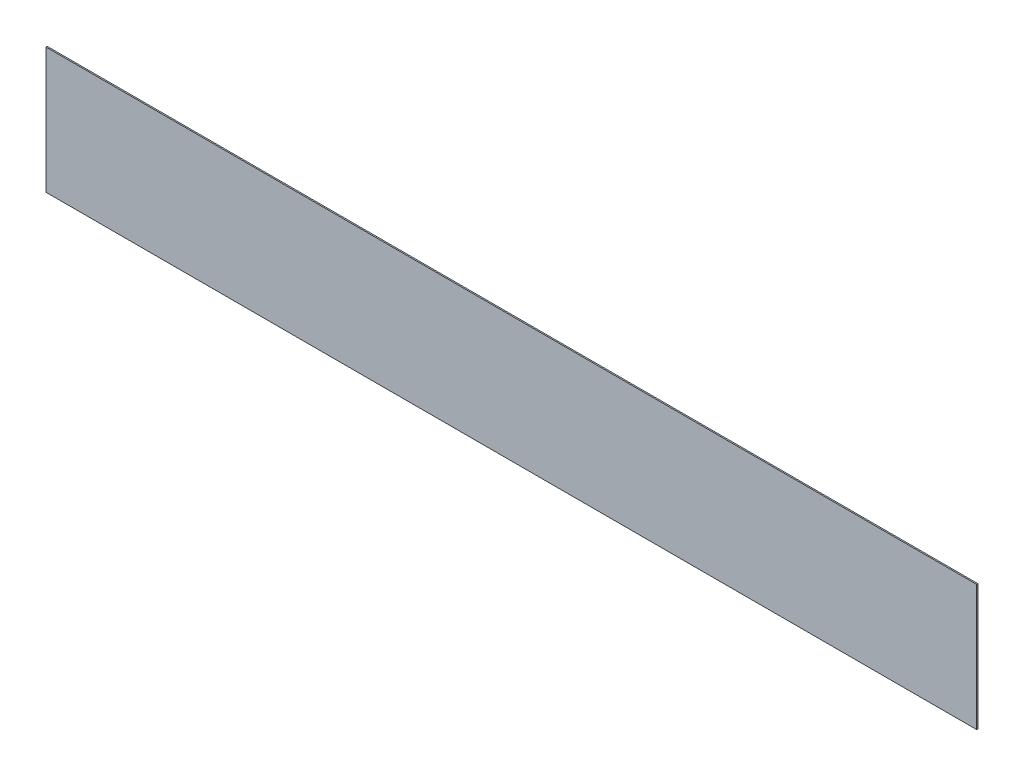
ISO-10303-21;
HEADER;
FILE_DESCRIPTION(('STEP AP214'),'2;1');
FILE_NAME('part.step','',(''),(''),'','','');
FILE_SCHEMA(('AUTOMOTIVE_DESIGN { 1 0 10303 214 1 1 1 1 }'));
ENDSEC;
DATA;
#1=APPLICATION_CONTEXT('core data for automotive mechanical design processes');
#2=APPLICATION_PROTOCOL_DEFINITION('international standard','automotive_design',2000,#1);
#3=PRODUCT_CONTEXT('',#1,'mechanical');
#4=PRODUCT('Part','Part','',(#3));
#5=PRODUCT_RELATED_PRODUCT_CATEGORY('part','',(#4));
#6=PRODUCT_DEFINITION_FORMATION('','',#4);
#7=PRODUCT_DEFINITION_CONTEXT('part definition',#1,'design');
#8=PRODUCT_DEFINITION('design','',#6,#7);
#9=PRODUCT_DEFINITION_SHAPE('','',#8);
#10=(LENGTH_UNIT() NAMED_UNIT(*) SI_UNIT(.MILLI.,.METRE.));
#11=(NAMED_UNIT(*) PLANE_ANGLE_UNIT() SI_UNIT($,.RADIAN.));
#12=(NAMED_UNIT(*) SI_UNIT($,.STERADIAN.) SOLID_ANGLE_UNIT());
#13=UNCERTAINTY_MEASURE_WITH_UNIT(LENGTH_MEASURE(1.E-05),#10,'distance_accuracy_value','');
#14=(GEOMETRIC_REPRESENTATION_CONTEXT(3) GLOBAL_UNCERTAINTY_ASSIGNED_CONTEXT((#13)) GLOBAL_UNIT_ASSIGNED_CONTEXT((#10,
#11,#12)) REPRESENTATION_CONTEXT('',''));
#15=CARTESIAN_POINT('',(0.,0.,0.));
#16=DIRECTION('',(0.,0.,1.));
#17=DIRECTION('',(1.,0.,0.));
#18=AXIS2_PLACEMENT_3D('',#15,#16,#17);
#19=CARTESIAN_POINT('',(-37.,-5.,0.1));
#20=DIRECTION('',(1.,0.,0.));
#21=DIRECTION('',(0.,1.,0.));
#22=AXIS2_PLACEMENT_3D('',#19,#20,#21);
#23=PLANE('',#22);
#24=DIRECTION('',(0.,-1.,0.));
#25=VECTOR('',#24,1.);
#26=CARTESIAN_POINT('',(-37.,-5.,0.));
#27=LINE('',#26,#25);
#28=CARTESIAN_POINT('',(-37.,5.,0.));
#29=VERTEX_POINT('',#28);
#30=CARTESIAN_POINT('',(-37.,-5.,0.));
#31=VERTEX_POINT('',#30);
#32=EDGE_CURVE('E99',#29,#31,#27,.T.);
#33=ORIENTED_EDGE('',*,*,#32,.T.);
#34=DIRECTION('',(0.,0.,-1.));
#35=VECTOR('',#34,1.);
#36=CARTESIAN_POINT('',(-37.,-5.,0.1));
#37=LINE('',#36,#35);
#38=CARTESIAN_POINT('',(-37.,-5.,0.1));
#39=VERTEX_POINT('',#38);
#40=EDGE_CURVE('E11',#39,#31,#37,.T.);
#41=ORIENTED_EDGE('',*,*,#40,.F.);
#42=DIRECTION('',(0.,-1.,0.));
#43=VECTOR('',#42,1.);
#44=CARTESIAN_POINT('',(-37.,-5.,0.1));
#45=LINE('',#44,#43);
#46=CARTESIAN_POINT('',(-37.,5.,0.1));
#47=VERTEX_POINT('',#46);
#48=EDGE_CURVE('E87',#47,#39,#45,.T.);
#49=ORIENTED_EDGE('',*,*,#48,.F.);
#50=DIRECTION('',(0.,0.,-1.));
#51=VECTOR('',#50,1.);
#52=CARTESIAN_POINT('',(-37.,5.,0.1));
#53=LINE('',#52,#51);
#54=EDGE_CURVE('E95',#47,#29,#53,.T.);
#55=ORIENTED_EDGE('',*,*,#54,.T.);
#56=EDGE_LOOP('',(#33,#41,#49,#55));
#57=FACE_BOUND('',#56,.T.);
#58=ADVANCED_FACE('F36',(#57),#23,.F.);
#59=CARTESIAN_POINT('',(37.,-4.99999999999999,0.1));
#60=DIRECTION('',(0.,1.,0.));
#61=DIRECTION('',(-1.,0.,0.));
#62=AXIS2_PLACEMENT_3D('',#59,#60,#61);
#63=PLANE('',#62);
#64=DIRECTION('',(1.,0.,0.));
#65=VECTOR('',#64,1.);
#66=CARTESIAN_POINT('',(37.,-4.99999999999999,0.));
#67=LINE('',#66,#65);
#68=CARTESIAN_POINT('',(37.,-4.99999999999999,0.));
#69=VERTEX_POINT('',#68);
#70=EDGE_CURVE('E91',#31,#69,#67,.T.);
#71=ORIENTED_EDGE('',*,*,#70,.T.);
#72=DIRECTION('',(0.,0.,-1.));
#73=VECTOR('',#72,1.);
#74=CARTESIAN_POINT('',(37.,-4.99999999999999,0.1));
#75=LINE('',#74,#73);
#76=CARTESIAN_POINT('',(37.,-4.99999999999999,0.1));
#77=VERTEX_POINT('',#76);
#78=EDGE_CURVE('E44',#77,#69,#75,.T.);
#79=ORIENTED_EDGE('',*,*,#78,.F.);
#80=DIRECTION('',(1.,0.,0.));
#81=VECTOR('',#80,1.);
#82=CARTESIAN_POINT('',(37.,-4.99999999999999,0.1));
#83=LINE('',#82,#81);
#84=EDGE_CURVE('E82',#39,#77,#83,.T.);
#85=ORIENTED_EDGE('',*,*,#84,.F.);
#86=ORIENTED_EDGE('',*,*,#40,.T.);
#87=EDGE_LOOP('',(#71,#79,#85,#86));
#88=FACE_BOUND('',#87,.T.);
#89=ADVANCED_FACE('F90',(#88),#63,.F.);
#90=CARTESIAN_POINT('',(37.,-4.99999999999999,0.1));
#91=DIRECTION('',(-1.,0.,0.));
#92=DIRECTION('',(0.,0.,1.));
#93=AXIS2_PLACEMENT_3D('',#90,#91,#92);
#94=PLANE('',#93);
#95=DIRECTION('',(0.,1.,0.));
#96=VECTOR('',#95,1.);
#97=CARTESIAN_POINT('',(37.,-4.99999999999999,0.));
#98=LINE('',#97,#96);
#99=CARTESIAN_POINT('',(37.,5.00000000000001,0.));
#100=VERTEX_POINT('',#99);
#101=EDGE_CURVE('E69',#69,#100,#98,.T.);
#102=ORIENTED_EDGE('',*,*,#101,.T.);
#103=DIRECTION('',(0.,0.,-1.));
#104=VECTOR('',#103,1.);
#105=CARTESIAN_POINT('',(37.,5.00000000000001,0.1));
#106=LINE('',#105,#104);
#107=CARTESIAN_POINT('',(37.,5.00000000000001,0.1));
#108=VERTEX_POINT('',#107);
#109=EDGE_CURVE('E92',#108,#100,#106,.T.);
#110=ORIENTED_EDGE('',*,*,#109,.F.);
#111=DIRECTION('',(0.,1.,0.));
#112=VECTOR('',#111,1.);
#113=CARTESIAN_POINT('',(37.,-4.99999999999999,0.1));
#114=LINE('',#113,#112);
#115=EDGE_CURVE('E85',#77,#108,#114,.T.);
#116=ORIENTED_EDGE('',*,*,#115,.F.);
#117=ORIENTED_EDGE('',*,*,#78,.T.);
#118=EDGE_LOOP('',(#102,#110,#116,#117));
#119=FACE_BOUND('',#118,.T.);
#120=ADVANCED_FACE('F93',(#119),#94,.F.);
#121=CARTESIAN_POINT('',(37.,5.00000000000001,0.1));
#122=DIRECTION('',(0.,-1.,0.));
#123=DIRECTION('',(1.,0.,0.));
#124=AXIS2_PLACEMENT_3D('',#121,#122,#123);
#125=PLANE('',#124);
#126=DIRECTION('',(-1.,0.,0.));
#127=VECTOR('',#126,1.);
#128=CARTESIAN_POINT('',(37.,5.00000000000001,0.));
#129=LINE('',#128,#127);
#130=EDGE_CURVE('E75',#100,#29,#129,.T.);
#131=ORIENTED_EDGE('',*,*,#130,.T.);
#132=ORIENTED_EDGE('',*,*,#54,.F.);
#133=DIRECTION('',(-1.,0.,0.));
#134=VECTOR('',#133,1.);
#135=CARTESIAN_POINT('',(37.,5.00000000000001,0.1));
#136=LINE('',#135,#134);
#137=EDGE_CURVE('E52',#108,#47,#136,.T.);
#138=ORIENTED_EDGE('',*,*,#137,.F.);
#139=ORIENTED_EDGE('',*,*,#109,.T.);
#140=EDGE_LOOP('',(#131,#132,#138,#139));
#141=FACE_BOUND('',#140,.T.);
#142=ADVANCED_FACE('F106',(#141),#125,.F.);
#143=CARTESIAN_POINT('',(0.,0.,0.1));
#144=DIRECTION('',(0.,0.,1.));
#145=DIRECTION('',(1.,0.,0.));
#146=AXIS2_PLACEMENT_3D('',#143,#144,#145);
#147=PLANE('',#146);
#148=ORIENTED_EDGE('',*,*,#48,.T.);
#149=ORIENTED_EDGE('',*,*,#84,.T.);
#150=ORIENTED_EDGE('',*,*,#115,.T.);
#151=ORIENTED_EDGE('',*,*,#137,.T.);
#152=EDGE_LOOP('',(#148,#149,#150,#151));
#153=FACE_BOUND('',#152,.T.);
#154=ADVANCED_FACE('F83',(#153),#147,.T.);
#155=CARTESIAN_POINT('',(0.,0.,0.));
#156=DIRECTION('',(0.,0.,1.));
#157=DIRECTION('',(1.,0.,0.));
#158=AXIS2_PLACEMENT_3D('',#155,#156,#157);
#159=PLANE('',#158);
#160=ORIENTED_EDGE('',*,*,#32,.F.);
#161=ORIENTED_EDGE('',*,*,#130,.F.);
#162=ORIENTED_EDGE('',*,*,#101,.F.);
#163=ORIENTED_EDGE('',*,*,#70,.F.);
#164=EDGE_LOOP('',(#160,#161,#162,#163));
#165=FACE_BOUND('',#164,.T.);
#166=ADVANCED_FACE('F109',(#165),#159,.F.);
#167=CLOSED_SHELL('',(#58,#89,#120,#142,#154,#166));
#168=MANIFOLD_SOLID_BREP('B2',#167);
#169=ADVANCED_BREP_SHAPE_REPRESENTATION('',(#18,#168),#14);
#170=SHAPE_DEFINITION_REPRESENTATION(#9,#169);
ENDSEC;
END-ISO-10303-21;
